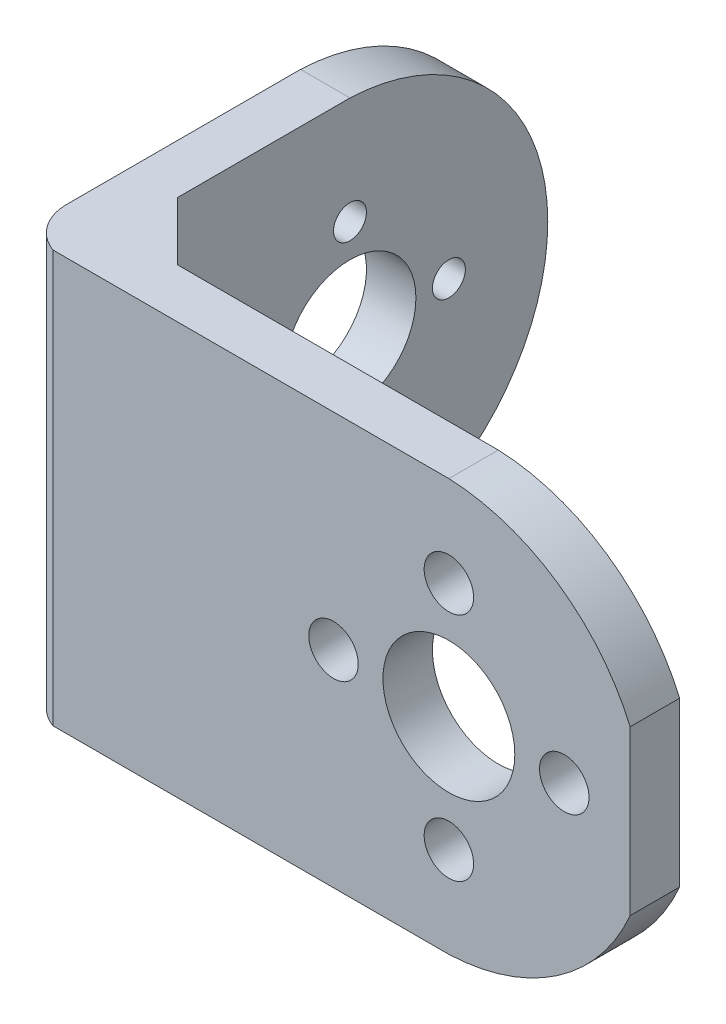
ISO-10303-21;
HEADER;
FILE_DESCRIPTION(('STEP AP214'),'2;1');
FILE_NAME('part.step','',(''),(''),'','','');
FILE_SCHEMA(('AUTOMOTIVE_DESIGN { 1 0 10303 214 1 1 1 1 }'));
ENDSEC;
DATA;
#1=APPLICATION_CONTEXT('core data for automotive mechanical design processes');
#2=APPLICATION_PROTOCOL_DEFINITION('international standard','automotive_design',2000,#1);
#3=PRODUCT_CONTEXT('',#1,'mechanical');
#4=PRODUCT('Part','Part','',(#3));
#5=PRODUCT_RELATED_PRODUCT_CATEGORY('part','',(#4));
#6=PRODUCT_DEFINITION_FORMATION('','',#4);
#7=PRODUCT_DEFINITION_CONTEXT('part definition',#1,'design');
#8=PRODUCT_DEFINITION('design','',#6,#7);
#9=PRODUCT_DEFINITION_SHAPE('','',#8);
#10=(LENGTH_UNIT() NAMED_UNIT(*) SI_UNIT(.MILLI.,.METRE.));
#11=(NAMED_UNIT(*) PLANE_ANGLE_UNIT() SI_UNIT($,.RADIAN.));
#12=(NAMED_UNIT(*) SI_UNIT($,.STERADIAN.) SOLID_ANGLE_UNIT());
#13=UNCERTAINTY_MEASURE_WITH_UNIT(LENGTH_MEASURE(1.E-05),#10,'distance_accuracy_value','');
#14=(GEOMETRIC_REPRESENTATION_CONTEXT(3) GLOBAL_UNCERTAINTY_ASSIGNED_CONTEXT((#13)) GLOBAL_UNIT_ASSIGNED_CONTEXT((#10,
#11,#12)) REPRESENTATION_CONTEXT('',''));
#15=CARTESIAN_POINT('',(0.,0.,0.));
#16=DIRECTION('',(0.,0.,1.));
#17=DIRECTION('',(1.,0.,0.));
#18=AXIS2_PLACEMENT_3D('',#15,#16,#17);
#19=CARTESIAN_POINT('',(0.,25.,1.));
#20=DIRECTION('',(0.,0.,-1.));
#21=DIRECTION('',(-1.,0.,0.));
#22=AXIS2_PLACEMENT_3D('',#19,#20,#21);
#23=PLANE('',#22);
#24=CARTESIAN_POINT('',(25.,19.5,1.));
#25=DIRECTION('',(0.,0.,1.));
#26=DIRECTION('',(1.,0.,0.));
#27=AXIS2_PLACEMENT_3D('',#24,#25,#26);
#28=CIRCLE('',#27,1.5);
#29=CARTESIAN_POINT('',(26.5,19.5,1.));
#30=VERTEX_POINT('',#29);
#31=EDGE_CURVE('E258',#30,#30,#28,.T.);
#32=ORIENTED_EDGE('',*,*,#31,.F.);
#33=EDGE_LOOP('',(#32));
#34=FACE_BOUND('',#33,.T.);
#35=CARTESIAN_POINT('',(32.0000000000001,12.5000000000001,1.));
#36=DIRECTION('',(0.,0.,1.));
#37=DIRECTION('',(1.,0.,0.));
#38=AXIS2_PLACEMENT_3D('',#35,#36,#37);
#39=CIRCLE('',#38,1.5);
#40=CARTESIAN_POINT('',(33.5000000000001,12.5000000000001,1.));
#41=VERTEX_POINT('',#40);
#42=EDGE_CURVE('E255',#41,#41,#39,.T.);
#43=ORIENTED_EDGE('',*,*,#42,.F.);
#44=EDGE_LOOP('',(#43));
#45=FACE_BOUND('',#44,.T.);
#46=CARTESIAN_POINT('',(25.0000000000002,5.5,1.));
#47=DIRECTION('',(0.,0.,1.));
#48=DIRECTION('',(1.,0.,0.));
#49=AXIS2_PLACEMENT_3D('',#46,#47,#48);
#50=CIRCLE('',#49,1.5);
#51=CARTESIAN_POINT('',(26.5000000000002,5.5,1.));
#52=VERTEX_POINT('',#51);
#53=EDGE_CURVE('E252',#52,#52,#50,.T.);
#54=ORIENTED_EDGE('',*,*,#53,.F.);
#55=EDGE_LOOP('',(#54));
#56=FACE_BOUND('',#55,.T.);
#57=CARTESIAN_POINT('',(18.0000000000001,12.5,1.));
#58=DIRECTION('',(0.,0.,1.));
#59=DIRECTION('',(1.,0.,0.));
#60=AXIS2_PLACEMENT_3D('',#57,#58,#59);
#61=CIRCLE('',#60,1.5);
#62=CARTESIAN_POINT('',(19.5000000000001,12.5,1.));
#63=VERTEX_POINT('',#62);
#64=EDGE_CURVE('E251',#63,#63,#61,.T.);
#65=ORIENTED_EDGE('',*,*,#64,.F.);
#66=EDGE_LOOP('',(#65));
#67=FACE_BOUND('',#66,.T.);
#68=CARTESIAN_POINT('',(25.,12.5,1.));
#69=DIRECTION('',(0.,0.,1.));
#70=DIRECTION('',(1.,0.,0.));
#71=AXIS2_PLACEMENT_3D('',#68,#69,#70);
#72=CIRCLE('',#71,4.);
#73=CARTESIAN_POINT('',(29.,12.5,1.));
#74=VERTEX_POINT('',#73);
#75=EDGE_CURVE('E176',#74,#74,#72,.T.);
#76=ORIENTED_EDGE('',*,*,#75,.F.);
#77=EDGE_LOOP('',(#76));
#78=FACE_BOUND('',#77,.T.);
#79=CARTESIAN_POINT('',(24.5166193979498,12.5,1.));
#80=DIRECTION('',(0.,0.,1.));
#81=DIRECTION('',(1.,0.,0.));
#82=AXIS2_PLACEMENT_3D('',#79,#80,#81);
#83=CIRCLE('',#82,12.5093427807554);
#84=CARTESIAN_POINT('',(36.,17.4614137858976,1.));
#85=VERTEX_POINT('',#84);
#86=CARTESIAN_POINT('',(25.,25.,1.));
#87=VERTEX_POINT('',#86);
#88=EDGE_CURVE('E192',#85,#87,#83,.T.);
#89=ORIENTED_EDGE('',*,*,#88,.T.);
#90=DIRECTION('',(1.,0.,0.));
#91=VECTOR('',#90,1.);
#92=CARTESIAN_POINT('',(0.,25.,1.));
#93=LINE('',#92,#91);
#94=CARTESIAN_POINT('',(0.979760199388005,25.,1.));
#95=VERTEX_POINT('',#94);
#96=EDGE_CURVE('E207',#95,#87,#93,.T.);
#97=ORIENTED_EDGE('',*,*,#96,.F.);
#98=DIRECTION('',(0.,-1.,0.));
#99=VECTOR('',#98,1.);
#100=CARTESIAN_POINT('',(0.979760199388005,25.,1.));
#101=LINE('',#100,#99);
#102=CARTESIAN_POINT('',(0.979760199388005,0.,1.));
#103=VERTEX_POINT('',#102);
#104=EDGE_CURVE('E161',#95,#103,#101,.T.);
#105=ORIENTED_EDGE('',*,*,#104,.T.);
#106=DIRECTION('',(1.,0.,0.));
#107=VECTOR('',#106,1.);
#108=CARTESIAN_POINT('',(0.,0.,1.));
#109=LINE('',#108,#107);
#110=CARTESIAN_POINT('',(25.,0.,1.));
#111=VERTEX_POINT('',#110);
#112=EDGE_CURVE('E150',#103,#111,#109,.T.);
#113=ORIENTED_EDGE('',*,*,#112,.T.);
#114=CARTESIAN_POINT('',(24.5166193979498,12.5,1.));
#115=DIRECTION('',(0.,0.,1.));
#116=DIRECTION('',(1.,0.,0.));
#117=AXIS2_PLACEMENT_3D('',#114,#115,#116);
#118=CIRCLE('',#117,12.5093427807554);
#119=CARTESIAN_POINT('',(36.,7.53858621410237,1.));
#120=VERTEX_POINT('',#119);
#121=EDGE_CURVE('E61',#111,#120,#118,.T.);
#122=ORIENTED_EDGE('',*,*,#121,.T.);
#123=DIRECTION('',(0.,-1.,0.));
#124=VECTOR('',#123,1.);
#125=CARTESIAN_POINT('',(36.,25.,1.));
#126=LINE('',#125,#124);
#127=EDGE_CURVE('E158',#85,#120,#126,.T.);
#128=ORIENTED_EDGE('',*,*,#127,.F.);
#129=EDGE_LOOP('',(#89,#97,#105,#113,#122,#128));
#130=FACE_BOUND('',#129,.T.);
#131=ADVANCED_FACE('F38',(#34,#45,#56,#67,#78,#130),#23,.F.);
#132=CARTESIAN_POINT('',(36.,25.,0.));
#133=DIRECTION('',(-1.,0.,0.));
#134=DIRECTION('',(0.,0.,1.));
#135=AXIS2_PLACEMENT_3D('',#132,#133,#134);
#136=PLANE('',#135);
#137=DIRECTION('',(0.,0.,1.));
#138=VECTOR('',#137,1.);
#139=CARTESIAN_POINT('',(36.,17.4614137858976,-24.));
#140=LINE('',#139,#138);
#141=CARTESIAN_POINT('',(36.,17.4614137858976,-2.));
#142=VERTEX_POINT('',#141);
#143=EDGE_CURVE('E195',#142,#85,#140,.T.);
#144=ORIENTED_EDGE('',*,*,#143,.T.);
#145=ORIENTED_EDGE('',*,*,#127,.T.);
#146=DIRECTION('',(0.,0.,1.));
#147=VECTOR('',#146,1.);
#148=CARTESIAN_POINT('',(36.,7.53858621410237,-24.));
#149=LINE('',#148,#147);
#150=CARTESIAN_POINT('',(36.,7.53858621410237,-2.));
#151=VERTEX_POINT('',#150);
#152=EDGE_CURVE('E188',#151,#120,#149,.T.);
#153=ORIENTED_EDGE('',*,*,#152,.F.);
#154=DIRECTION('',(0.,-1.,0.));
#155=VECTOR('',#154,1.);
#156=CARTESIAN_POINT('',(36.,25.,-2.));
#157=LINE('',#156,#155);
#158=EDGE_CURVE('E155',#142,#151,#157,.T.);
#159=ORIENTED_EDGE('',*,*,#158,.F.);
#160=EDGE_LOOP('',(#144,#145,#153,#159));
#161=FACE_BOUND('',#160,.T.);
#162=ADVANCED_FACE('F267',(#161),#136,.F.);
#163=CARTESIAN_POINT('',(0.,25.,-2.));
#164=DIRECTION('',(0.,0.,1.));
#165=DIRECTION('',(1.,0.,0.));
#166=AXIS2_PLACEMENT_3D('',#163,#164,#165);
#167=PLANE('',#166);
#168=CARTESIAN_POINT('',(25.,19.5,-2.));
#169=DIRECTION('',(0.,0.,1.));
#170=DIRECTION('',(1.,0.,0.));
#171=AXIS2_PLACEMENT_3D('',#168,#169,#170);
#172=CIRCLE('',#171,1.5);
#173=CARTESIAN_POINT('',(26.5,19.5,-2.));
#174=VERTEX_POINT('',#173);
#175=EDGE_CURVE('E184',#174,#174,#172,.T.);
#176=ORIENTED_EDGE('',*,*,#175,.T.);
#177=EDGE_LOOP('',(#176));
#178=FACE_BOUND('',#177,.T.);
#179=CARTESIAN_POINT('',(32.0000000000001,12.5000000000001,-2.));
#180=DIRECTION('',(0.,0.,1.));
#181=DIRECTION('',(1.,0.,0.));
#182=AXIS2_PLACEMENT_3D('',#179,#180,#181);
#183=CIRCLE('',#182,1.5);
#184=CARTESIAN_POINT('',(33.5000000000001,12.5000000000001,-2.));
#185=VERTEX_POINT('',#184);
#186=EDGE_CURVE('E182',#185,#185,#183,.T.);
#187=ORIENTED_EDGE('',*,*,#186,.T.);
#188=EDGE_LOOP('',(#187));
#189=FACE_BOUND('',#188,.T.);
#190=CARTESIAN_POINT('',(25.0000000000002,5.5,-2.));
#191=DIRECTION('',(0.,0.,1.));
#192=DIRECTION('',(1.,0.,0.));
#193=AXIS2_PLACEMENT_3D('',#190,#191,#192);
#194=CIRCLE('',#193,1.5);
#195=CARTESIAN_POINT('',(26.5000000000002,5.5,-2.));
#196=VERTEX_POINT('',#195);
#197=EDGE_CURVE('E179',#196,#196,#194,.T.);
#198=ORIENTED_EDGE('',*,*,#197,.T.);
#199=EDGE_LOOP('',(#198));
#200=FACE_BOUND('',#199,.T.);
#201=CARTESIAN_POINT('',(18.0000000000001,12.5,-2.));
#202=DIRECTION('',(0.,0.,1.));
#203=DIRECTION('',(1.,0.,0.));
#204=AXIS2_PLACEMENT_3D('',#201,#202,#203);
#205=CIRCLE('',#204,1.5);
#206=CARTESIAN_POINT('',(19.5000000000001,12.5,-2.));
#207=VERTEX_POINT('',#206);
#208=EDGE_CURVE('E175',#207,#207,#205,.T.);
#209=ORIENTED_EDGE('',*,*,#208,.T.);
#210=EDGE_LOOP('',(#209));
#211=FACE_BOUND('',#210,.T.);
#212=CARTESIAN_POINT('',(25.,12.5,-2.));
#213=DIRECTION('',(0.,0.,1.));
#214=DIRECTION('',(1.,0.,0.));
#215=AXIS2_PLACEMENT_3D('',#212,#213,#214);
#216=CIRCLE('',#215,4.);
#217=CARTESIAN_POINT('',(29.,12.5,-2.));
#218=VERTEX_POINT('',#217);
#219=EDGE_CURVE('E172',#218,#218,#216,.T.);
#220=ORIENTED_EDGE('',*,*,#219,.T.);
#221=EDGE_LOOP('',(#220));
#222=FACE_BOUND('',#221,.T.);
#223=DIRECTION('',(-1.,0.,0.));
#224=VECTOR('',#223,1.);
#225=CARTESIAN_POINT('',(0.,0.,-2.));
#226=LINE('',#225,#224);
#227=CARTESIAN_POINT('',(25.,0.,-2.));
#228=VERTEX_POINT('',#227);
#229=CARTESIAN_POINT('',(5.54335490127289,0.,-2.));
#230=VERTEX_POINT('',#229);
#231=EDGE_CURVE('E153',#228,#230,#226,.T.);
#232=ORIENTED_EDGE('',*,*,#231,.T.);
#233=DIRECTION('',(0.,1.,0.));
#234=VECTOR('',#233,1.);
#235=CARTESIAN_POINT('',(5.54335490127289,25.,-2.));
#236=LINE('',#235,#234);
#237=CARTESIAN_POINT('',(5.54335490127289,25.,-2.));
#238=VERTEX_POINT('',#237);
#239=EDGE_CURVE('E118',#230,#238,#236,.T.);
#240=ORIENTED_EDGE('',*,*,#239,.T.);
#241=DIRECTION('',(-1.,0.,0.));
#242=VECTOR('',#241,1.);
#243=CARTESIAN_POINT('',(0.,25.,-2.));
#244=LINE('',#243,#242);
#245=CARTESIAN_POINT('',(25.,25.,-2.));
#246=VERTEX_POINT('',#245);
#247=EDGE_CURVE('E146',#246,#238,#244,.T.);
#248=ORIENTED_EDGE('',*,*,#247,.F.);
#249=CARTESIAN_POINT('',(24.5166193979498,12.5,-2.));
#250=DIRECTION('',(0.,0.,1.));
#251=DIRECTION('',(1.,0.,0.));
#252=AXIS2_PLACEMENT_3D('',#249,#250,#251);
#253=CIRCLE('',#252,12.5093427807554);
#254=EDGE_CURVE('E53',#142,#246,#253,.T.);
#255=ORIENTED_EDGE('',*,*,#254,.F.);
#256=ORIENTED_EDGE('',*,*,#158,.T.);
#257=CARTESIAN_POINT('',(24.5166193979498,12.5,-2.));
#258=DIRECTION('',(0.,0.,1.));
#259=DIRECTION('',(1.,0.,0.));
#260=AXIS2_PLACEMENT_3D('',#257,#258,#259);
#261=CIRCLE('',#260,12.5093427807554);
#262=EDGE_CURVE('E198',#228,#151,#261,.T.);
#263=ORIENTED_EDGE('',*,*,#262,.F.);
#264=EDGE_LOOP('',(#232,#240,#248,#255,#256,#263));
#265=FACE_BOUND('',#264,.T.);
#266=ADVANCED_FACE('F215',(#178,#189,#200,#211,#222,#265),#167,.F.);
#267=CARTESIAN_POINT('',(0.,25.,0.));
#268=DIRECTION('',(0.,1.,0.));
#269=DIRECTION('',(0.,0.,1.));
#270=AXIS2_PLACEMENT_3D('',#267,#268,#269);
#271=PLANE('',#270);
#272=ORIENTED_EDGE('',*,*,#247,.T.);
#273=DIRECTION('',(-0.707106781186548,0.,-0.707106781186548));
#274=VECTOR('',#273,1.);
#275=CARTESIAN_POINT('',(0.998168154015269,25.,-6.54518674725762));
#276=LINE('',#275,#274);
#277=CARTESIAN_POINT('',(2.,25.,-5.54335490127289));
#278=VERTEX_POINT('',#277);
#279=EDGE_CURVE('E123',#238,#278,#276,.T.);
#280=ORIENTED_EDGE('',*,*,#279,.T.);
#281=DIRECTION('',(0.,0.,1.));
#282=VECTOR('',#281,1.);
#283=CARTESIAN_POINT('',(2.,25.,0.));
#284=LINE('',#283,#282);
#285=CARTESIAN_POINT('',(2.,25.,-16.));
#286=VERTEX_POINT('',#285);
#287=EDGE_CURVE('E132',#286,#278,#284,.T.);
#288=ORIENTED_EDGE('',*,*,#287,.F.);
#289=DIRECTION('',(-1.,0.,0.));
#290=VECTOR('',#289,1.);
#291=CARTESIAN_POINT('',(24.,25.,-16.));
#292=LINE('',#291,#290);
#293=CARTESIAN_POINT('',(-1.,25.,-16.));
#294=VERTEX_POINT('',#293);
#295=EDGE_CURVE('E166',#294,#286,#292,.F.);
#296=ORIENTED_EDGE('',*,*,#295,.F.);
#297=DIRECTION('',(0.,0.,-1.));
#298=VECTOR('',#297,1.);
#299=CARTESIAN_POINT('',(-1.,25.,0.));
#300=LINE('',#299,#298);
#301=CARTESIAN_POINT('',(-1.,25.,-1.65907540690337));
#302=VERTEX_POINT('',#301);
#303=EDGE_CURVE('E203',#302,#294,#300,.T.);
#304=ORIENTED_EDGE('',*,*,#303,.F.);
#305=CARTESIAN_POINT('',(2.00457516811089,25.,-1.82953770345168));
#306=DIRECTION('',(0.,1.,0.));
#307=DIRECTION('',(0.,0.,1.));
#308=AXIS2_PLACEMENT_3D('',#305,#306,#307);
#309=CIRCLE('',#308,3.00940680788974);
#310=EDGE_CURVE('E206',#302,#95,#309,.T.);
#311=ORIENTED_EDGE('',*,*,#310,.T.);
#312=ORIENTED_EDGE('',*,*,#96,.T.);
#313=DIRECTION('',(0.,0.,1.));
#314=VECTOR('',#313,1.);
#315=CARTESIAN_POINT('',(25.,25.,-24.));
#316=LINE('',#315,#314);
#317=EDGE_CURVE('E46',#87,#246,#316,.F.);
#318=ORIENTED_EDGE('',*,*,#317,.T.);
#319=EDGE_LOOP('',(#272,#280,#288,#296,#304,#311,#312,#318));
#320=FACE_BOUND('',#319,.T.);
#321=ADVANCED_FACE('F213',(#320),#271,.T.);
#322=CARTESIAN_POINT('',(0.,0.,0.));
#323=DIRECTION('',(0.,1.,0.));
#324=DIRECTION('',(0.,0.,1.));
#325=AXIS2_PLACEMENT_3D('',#322,#323,#324);
#326=PLANE('',#325);
#327=DIRECTION('',(0.707106781186548,0.,0.707106781186548));
#328=VECTOR('',#327,1.);
#329=CARTESIAN_POINT('',(0.998168154015269,0.,-6.54518674725762));
#330=LINE('',#329,#328);
#331=CARTESIAN_POINT('',(2.,0.,-5.54335490127289));
#332=VERTEX_POINT('',#331);
#333=EDGE_CURVE('E113',#332,#230,#330,.T.);
#334=ORIENTED_EDGE('',*,*,#333,.T.);
#335=ORIENTED_EDGE('',*,*,#231,.F.);
#336=DIRECTION('',(0.,0.,1.));
#337=VECTOR('',#336,1.);
#338=CARTESIAN_POINT('',(25.,0.,-24.));
#339=LINE('',#338,#337);
#340=EDGE_CURVE('E169',#111,#228,#339,.F.);
#341=ORIENTED_EDGE('',*,*,#340,.F.);
#342=ORIENTED_EDGE('',*,*,#112,.F.);
#343=CARTESIAN_POINT('',(2.00457516811089,0.,-1.82953770345168));
#344=DIRECTION('',(0.,1.,0.));
#345=DIRECTION('',(0.,0.,1.));
#346=AXIS2_PLACEMENT_3D('',#343,#344,#345);
#347=CIRCLE('',#346,3.00940680788974);
#348=CARTESIAN_POINT('',(-1.,0.,-1.65907540690337));
#349=VERTEX_POINT('',#348);
#350=EDGE_CURVE('E141',#349,#103,#347,.T.);
#351=ORIENTED_EDGE('',*,*,#350,.F.);
#352=DIRECTION('',(0.,0.,-1.));
#353=VECTOR('',#352,1.);
#354=CARTESIAN_POINT('',(-1.,0.,0.));
#355=LINE('',#354,#353);
#356=CARTESIAN_POINT('',(-1.,0.,-16.));
#357=VERTEX_POINT('',#356);
#358=EDGE_CURVE('E138',#349,#357,#355,.T.);
#359=ORIENTED_EDGE('',*,*,#358,.T.);
#360=DIRECTION('',(-1.,0.,0.));
#361=VECTOR('',#360,1.);
#362=CARTESIAN_POINT('',(24.,0.,-16.));
#363=LINE('',#362,#361);
#364=CARTESIAN_POINT('',(2.,0.,-16.));
#365=VERTEX_POINT('',#364);
#366=EDGE_CURVE('E137',#357,#365,#363,.F.);
#367=ORIENTED_EDGE('',*,*,#366,.T.);
#368=DIRECTION('',(0.,0.,1.));
#369=VECTOR('',#368,1.);
#370=CARTESIAN_POINT('',(2.,0.,0.));
#371=LINE('',#370,#369);
#372=EDGE_CURVE('E130',#365,#332,#371,.T.);
#373=ORIENTED_EDGE('',*,*,#372,.T.);
#374=EDGE_LOOP('',(#334,#335,#341,#342,#351,#359,#367,#373));
#375=FACE_BOUND('',#374,.T.);
#376=ADVANCED_FACE('F134',(#375),#326,.F.);
#377=CARTESIAN_POINT('',(2.,25.,0.));
#378=DIRECTION('',(1.,0.,0.));
#379=DIRECTION('',(0.,0.,-1.));
#380=AXIS2_PLACEMENT_3D('',#377,#378,#379);
#381=PLANE('',#380);
#382=DIRECTION('',(0.,1.,0.));
#383=VECTOR('',#382,1.);
#384=CARTESIAN_POINT('',(2.,25.,-5.54335490127289));
#385=LINE('',#384,#383);
#386=EDGE_CURVE('E12',#332,#278,#385,.T.);
#387=ORIENTED_EDGE('',*,*,#386,.F.);
#388=ORIENTED_EDGE('',*,*,#372,.F.);
#389=CARTESIAN_POINT('',(2.,12.5,-15.4895833333333));
#390=DIRECTION('',(1.,0.,0.));
#391=DIRECTION('',(0.,0.,-1.));
#392=AXIS2_PLACEMENT_3D('',#389,#390,#391);
#393=CIRCLE('',#392,12.5104166666667);
#394=EDGE_CURVE('E139',#286,#365,#393,.F.);
#395=ORIENTED_EDGE('',*,*,#394,.F.);
#396=ORIENTED_EDGE('',*,*,#287,.T.);
#397=EDGE_LOOP('',(#387,#388,#395,#396));
#398=FACE_BOUND('',#397,.T.);
#399=CARTESIAN_POINT('',(2.,18.5,-16.));
#400=DIRECTION('',(1.,0.,0.));
#401=DIRECTION('',(0.,0.,-1.));
#402=AXIS2_PLACEMENT_3D('',#399,#400,#401);
#403=CIRCLE('',#402,1.);
#404=CARTESIAN_POINT('',(2.,18.5,-17.));
#405=VERTEX_POINT('',#404);
#406=EDGE_CURVE('E248',#405,#405,#403,.T.);
#407=ORIENTED_EDGE('',*,*,#406,.F.);
#408=EDGE_LOOP('',(#407));
#409=FACE_BOUND('',#408,.T.);
#410=CARTESIAN_POINT('',(2.,12.5000000000001,-9.99999999999991));
#411=DIRECTION('',(1.,0.,0.));
#412=DIRECTION('',(0.,0.,-1.));
#413=AXIS2_PLACEMENT_3D('',#410,#411,#412);
#414=CIRCLE('',#413,1.);
#415=CARTESIAN_POINT('',(2.,12.5000000000001,-10.9999999999999));
#416=VERTEX_POINT('',#415);
#417=EDGE_CURVE('E245',#416,#416,#414,.T.);
#418=ORIENTED_EDGE('',*,*,#417,.F.);
#419=EDGE_LOOP('',(#418));
#420=FACE_BOUND('',#419,.T.);
#421=CARTESIAN_POINT('',(2.,6.5,-15.9999999999999));
#422=DIRECTION('',(1.,0.,0.));
#423=DIRECTION('',(0.,0.,-1.));
#424=AXIS2_PLACEMENT_3D('',#421,#422,#423);
#425=CIRCLE('',#424,1.);
#426=CARTESIAN_POINT('',(2.,6.5,-16.9999999999999));
#427=VERTEX_POINT('',#426);
#428=EDGE_CURVE('E242',#427,#427,#425,.T.);
#429=ORIENTED_EDGE('',*,*,#428,.F.);
#430=EDGE_LOOP('',(#429));
#431=FACE_BOUND('',#430,.T.);
#432=CARTESIAN_POINT('',(2.,12.5,-21.9999999999999));
#433=DIRECTION('',(1.,0.,0.));
#434=DIRECTION('',(0.,0.,-1.));
#435=AXIS2_PLACEMENT_3D('',#432,#433,#434);
#436=CIRCLE('',#435,0.999999999999999);
#437=CARTESIAN_POINT('',(2.,12.5,-22.9999999999999));
#438=VERTEX_POINT('',#437);
#439=EDGE_CURVE('E239',#438,#438,#436,.T.);
#440=ORIENTED_EDGE('',*,*,#439,.F.);
#441=EDGE_LOOP('',(#440));
#442=FACE_BOUND('',#441,.T.);
#443=CARTESIAN_POINT('',(2.,12.5,-16.));
#444=DIRECTION('',(1.,0.,0.));
#445=DIRECTION('',(0.,0.,-1.));
#446=AXIS2_PLACEMENT_3D('',#443,#444,#445);
#447=CIRCLE('',#446,4.);
#448=CARTESIAN_POINT('',(2.,12.5,-20.));
#449=VERTEX_POINT('',#448);
#450=EDGE_CURVE('E236',#449,#449,#447,.T.);
#451=ORIENTED_EDGE('',*,*,#450,.F.);
#452=EDGE_LOOP('',(#451));
#453=FACE_BOUND('',#452,.T.);
#454=ADVANCED_FACE('F40',(#398,#409,#420,#431,#442,#453),#381,.T.);
#455=CARTESIAN_POINT('',(-1.,25.,0.));
#456=DIRECTION('',(-1.,0.,0.));
#457=DIRECTION('',(0.,0.,1.));
#458=AXIS2_PLACEMENT_3D('',#455,#456,#457);
#459=PLANE('',#458);
#460=CARTESIAN_POINT('',(-1.,18.5,-16.));
#461=DIRECTION('',(-1.,0.,0.));
#462=DIRECTION('',(0.,0.,1.));
#463=AXIS2_PLACEMENT_3D('',#460,#461,#462);
#464=CIRCLE('',#463,1.);
#465=CARTESIAN_POINT('',(-1.,18.5,-15.));
#466=VERTEX_POINT('',#465);
#467=EDGE_CURVE('E228',#466,#466,#464,.T.);
#468=ORIENTED_EDGE('',*,*,#467,.F.);
#469=EDGE_LOOP('',(#468));
#470=FACE_BOUND('',#469,.T.);
#471=CARTESIAN_POINT('',(-1.,12.5000000000001,-9.99999999999991));
#472=DIRECTION('',(-1.,0.,0.));
#473=DIRECTION('',(0.,0.,1.));
#474=AXIS2_PLACEMENT_3D('',#471,#472,#473);
#475=CIRCLE('',#474,1.);
#476=CARTESIAN_POINT('',(-1.,12.5000000000001,-8.99999999999991));
#477=VERTEX_POINT('',#476);
#478=EDGE_CURVE('E226',#477,#477,#475,.T.);
#479=ORIENTED_EDGE('',*,*,#478,.F.);
#480=EDGE_LOOP('',(#479));
#481=FACE_BOUND('',#480,.T.);
#482=CARTESIAN_POINT('',(-1.,6.5,-15.9999999999999));
#483=DIRECTION('',(-1.,0.,0.));
#484=DIRECTION('',(0.,0.,1.));
#485=AXIS2_PLACEMENT_3D('',#482,#483,#484);
#486=CIRCLE('',#485,1.);
#487=CARTESIAN_POINT('',(-1.,6.5,-14.9999999999999));
#488=VERTEX_POINT('',#487);
#489=EDGE_CURVE('E221',#488,#488,#486,.T.);
#490=ORIENTED_EDGE('',*,*,#489,.F.);
#491=EDGE_LOOP('',(#490));
#492=FACE_BOUND('',#491,.T.);
#493=CARTESIAN_POINT('',(-1.,12.5,-21.9999999999999));
#494=DIRECTION('',(-1.,0.,0.));
#495=DIRECTION('',(0.,0.,1.));
#496=AXIS2_PLACEMENT_3D('',#493,#494,#495);
#497=CIRCLE('',#496,0.999999999999999);
#498=CARTESIAN_POINT('',(-1.,12.5,-20.9999999999999));
#499=VERTEX_POINT('',#498);
#500=EDGE_CURVE('E218',#499,#499,#497,.T.);
#501=ORIENTED_EDGE('',*,*,#500,.F.);
#502=EDGE_LOOP('',(#501));
#503=FACE_BOUND('',#502,.T.);
#504=CARTESIAN_POINT('',(-1.,12.5,-16.));
#505=DIRECTION('',(-1.,0.,0.));
#506=DIRECTION('',(0.,0.,1.));
#507=AXIS2_PLACEMENT_3D('',#504,#505,#506);
#508=CIRCLE('',#507,4.);
#509=CARTESIAN_POINT('',(-1.,12.5,-12.));
#510=VERTEX_POINT('',#509);
#511=EDGE_CURVE('E231',#510,#510,#508,.T.);
#512=ORIENTED_EDGE('',*,*,#511,.F.);
#513=EDGE_LOOP('',(#512));
#514=FACE_BOUND('',#513,.T.);
#515=CARTESIAN_POINT('',(-1.,12.5,-15.4895833333333));
#516=DIRECTION('',(-1.,0.,0.));
#517=DIRECTION('',(0.,0.,1.));
#518=AXIS2_PLACEMENT_3D('',#515,#516,#517);
#519=CIRCLE('',#518,12.5104166666667);
#520=EDGE_CURVE('E143',#357,#294,#519,.F.);
#521=ORIENTED_EDGE('',*,*,#520,.F.);
#522=ORIENTED_EDGE('',*,*,#358,.F.);
#523=DIRECTION('',(0.,-1.,0.));
#524=VECTOR('',#523,1.);
#525=CARTESIAN_POINT('',(-1.,25.,-1.65907540690337));
#526=LINE('',#525,#524);
#527=EDGE_CURVE('E164',#302,#349,#526,.T.);
#528=ORIENTED_EDGE('',*,*,#527,.F.);
#529=ORIENTED_EDGE('',*,*,#303,.T.);
#530=EDGE_LOOP('',(#521,#522,#528,#529));
#531=FACE_BOUND('',#530,.T.);
#532=ADVANCED_FACE('F283',(#470,#481,#492,#503,#514,#531),#459,.T.);
#533=CARTESIAN_POINT('',(2.00457516811089,25.,-1.82953770345168));
#534=DIRECTION('',(0.,-1.,0.));
#535=DIRECTION('',(0.,0.,-1.));
#536=AXIS2_PLACEMENT_3D('',#533,#534,#535);
#537=CYLINDRICAL_SURFACE('',#536,3.00940680788974);
#538=ORIENTED_EDGE('',*,*,#350,.T.);
#539=ORIENTED_EDGE('',*,*,#104,.F.);
#540=ORIENTED_EDGE('',*,*,#310,.F.);
#541=ORIENTED_EDGE('',*,*,#527,.T.);
#542=EDGE_LOOP('',(#538,#539,#540,#541));
#543=FACE_BOUND('',#542,.T.);
#544=ADVANCED_FACE('F280',(#543),#537,.T.);
#545=CARTESIAN_POINT('',(24.,12.5,-15.4895833333333));
#546=DIRECTION('',(-1.,0.,0.));
#547=DIRECTION('',(0.,0.,1.));
#548=AXIS2_PLACEMENT_3D('',#545,#546,#547);
#549=CYLINDRICAL_SURFACE('',#548,12.5104166666667);
#550=ORIENTED_EDGE('',*,*,#394,.T.);
#551=ORIENTED_EDGE('',*,*,#366,.F.);
#552=ORIENTED_EDGE('',*,*,#520,.T.);
#553=ORIENTED_EDGE('',*,*,#295,.T.);
#554=EDGE_LOOP('',(#550,#551,#552,#553));
#555=FACE_BOUND('',#554,.T.);
#556=ADVANCED_FACE('F282',(#555),#549,.T.);
#557=CARTESIAN_POINT('',(24.5166193979498,12.5,-24.));
#558=DIRECTION('',(0.,0.,1.));
#559=DIRECTION('',(1.,0.,0.));
#560=AXIS2_PLACEMENT_3D('',#557,#558,#559);
#561=CYLINDRICAL_SURFACE('',#560,12.5093427807554);
#562=ORIENTED_EDGE('',*,*,#262,.T.);
#563=ORIENTED_EDGE('',*,*,#152,.T.);
#564=ORIENTED_EDGE('',*,*,#121,.F.);
#565=ORIENTED_EDGE('',*,*,#340,.T.);
#566=EDGE_LOOP('',(#562,#563,#564,#565));
#567=FACE_BOUND('',#566,.T.);
#568=ADVANCED_FACE('F309',(#567),#561,.T.);
#569=CARTESIAN_POINT('',(24.5166193979498,12.5,-24.));
#570=DIRECTION('',(0.,0.,1.));
#571=DIRECTION('',(1.,0.,0.));
#572=AXIS2_PLACEMENT_3D('',#569,#570,#571);
#573=CYLINDRICAL_SURFACE('',#572,12.5093427807554);
#574=ORIENTED_EDGE('',*,*,#254,.T.);
#575=ORIENTED_EDGE('',*,*,#317,.F.);
#576=ORIENTED_EDGE('',*,*,#88,.F.);
#577=ORIENTED_EDGE('',*,*,#143,.F.);
#578=EDGE_LOOP('',(#574,#575,#576,#577));
#579=FACE_BOUND('',#578,.T.);
#580=ADVANCED_FACE('F311',(#579),#573,.T.);
#581=CARTESIAN_POINT('',(25.,12.5,-24.));
#582=DIRECTION('',(0.,0.,1.));
#583=DIRECTION('',(1.,0.,0.));
#584=AXIS2_PLACEMENT_3D('',#581,#582,#583);
#585=CYLINDRICAL_SURFACE('',#584,4.);
#586=ORIENTED_EDGE('',*,*,#75,.T.);
#587=EDGE_LOOP('',(#586));
#588=FACE_BOUND('',#587,.T.);
#589=ORIENTED_EDGE('',*,*,#219,.F.);
#590=EDGE_LOOP('',(#589));
#591=FACE_BOUND('',#590,.T.);
#592=ADVANCED_FACE('F317',(#588,#591),#585,.F.);
#593=CARTESIAN_POINT('',(18.0000000000001,12.5,-24.));
#594=DIRECTION('',(0.,0.,1.));
#595=DIRECTION('',(1.,0.,0.));
#596=AXIS2_PLACEMENT_3D('',#593,#594,#595);
#597=CYLINDRICAL_SURFACE('',#596,1.5);
#598=ORIENTED_EDGE('',*,*,#64,.T.);
#599=EDGE_LOOP('',(#598));
#600=FACE_BOUND('',#599,.T.);
#601=ORIENTED_EDGE('',*,*,#208,.F.);
#602=EDGE_LOOP('',(#601));
#603=FACE_BOUND('',#602,.T.);
#604=ADVANCED_FACE('F340',(#600,#603),#597,.F.);
#605=CARTESIAN_POINT('',(25.0000000000002,5.5,-24.));
#606=DIRECTION('',(0.,0.,1.));
#607=DIRECTION('',(1.,0.,0.));
#608=AXIS2_PLACEMENT_3D('',#605,#606,#607);
#609=CYLINDRICAL_SURFACE('',#608,1.5);
#610=ORIENTED_EDGE('',*,*,#53,.T.);
#611=EDGE_LOOP('',(#610));
#612=FACE_BOUND('',#611,.T.);
#613=ORIENTED_EDGE('',*,*,#197,.F.);
#614=EDGE_LOOP('',(#613));
#615=FACE_BOUND('',#614,.T.);
#616=ADVANCED_FACE('F345',(#612,#615),#609,.F.);
#617=CARTESIAN_POINT('',(32.0000000000001,12.5000000000001,-24.));
#618=DIRECTION('',(0.,0.,1.));
#619=DIRECTION('',(1.,0.,0.));
#620=AXIS2_PLACEMENT_3D('',#617,#618,#619);
#621=CYLINDRICAL_SURFACE('',#620,1.5);
#622=ORIENTED_EDGE('',*,*,#42,.T.);
#623=EDGE_LOOP('',(#622));
#624=FACE_BOUND('',#623,.T.);
#625=ORIENTED_EDGE('',*,*,#186,.F.);
#626=EDGE_LOOP('',(#625));
#627=FACE_BOUND('',#626,.T.);
#628=ADVANCED_FACE('F349',(#624,#627),#621,.F.);
#629=CARTESIAN_POINT('',(25.,19.5,-24.));
#630=DIRECTION('',(0.,0.,1.));
#631=DIRECTION('',(1.,0.,0.));
#632=AXIS2_PLACEMENT_3D('',#629,#630,#631);
#633=CYLINDRICAL_SURFACE('',#632,1.5);
#634=ORIENTED_EDGE('',*,*,#31,.T.);
#635=EDGE_LOOP('',(#634));
#636=FACE_BOUND('',#635,.T.);
#637=ORIENTED_EDGE('',*,*,#175,.F.);
#638=EDGE_LOOP('',(#637));
#639=FACE_BOUND('',#638,.T.);
#640=ADVANCED_FACE('F352',(#636,#639),#633,.F.);
#641=CARTESIAN_POINT('',(24.,12.5,-16.));
#642=DIRECTION('',(-1.,0.,0.));
#643=DIRECTION('',(0.,0.,1.));
#644=AXIS2_PLACEMENT_3D('',#641,#642,#643);
#645=CYLINDRICAL_SURFACE('',#644,4.);
#646=ORIENTED_EDGE('',*,*,#450,.T.);
#647=EDGE_LOOP('',(#646));
#648=FACE_BOUND('',#647,.T.);
#649=ORIENTED_EDGE('',*,*,#511,.T.);
#650=EDGE_LOOP('',(#649));
#651=FACE_BOUND('',#650,.T.);
#652=ADVANCED_FACE('F355',(#648,#651),#645,.F.);
#653=CARTESIAN_POINT('',(24.,12.5,-21.9999999999999));
#654=DIRECTION('',(-1.,0.,0.));
#655=DIRECTION('',(0.,0.,1.));
#656=AXIS2_PLACEMENT_3D('',#653,#654,#655);
#657=CYLINDRICAL_SURFACE('',#656,0.999999999999999);
#658=ORIENTED_EDGE('',*,*,#439,.T.);
#659=EDGE_LOOP('',(#658));
#660=FACE_BOUND('',#659,.T.);
#661=ORIENTED_EDGE('',*,*,#500,.T.);
#662=EDGE_LOOP('',(#661));
#663=FACE_BOUND('',#662,.T.);
#664=ADVANCED_FACE('F363',(#660,#663),#657,.F.);
#665=CARTESIAN_POINT('',(24.,6.5,-15.9999999999999));
#666=DIRECTION('',(-1.,0.,0.));
#667=DIRECTION('',(0.,0.,1.));
#668=AXIS2_PLACEMENT_3D('',#665,#666,#667);
#669=CYLINDRICAL_SURFACE('',#668,1.);
#670=ORIENTED_EDGE('',*,*,#428,.T.);
#671=EDGE_LOOP('',(#670));
#672=FACE_BOUND('',#671,.T.);
#673=ORIENTED_EDGE('',*,*,#489,.T.);
#674=EDGE_LOOP('',(#673));
#675=FACE_BOUND('',#674,.T.);
#676=ADVANCED_FACE('F369',(#672,#675),#669,.F.);
#677=CARTESIAN_POINT('',(24.,12.5000000000001,-9.99999999999991));
#678=DIRECTION('',(-1.,0.,0.));
#679=DIRECTION('',(0.,0.,1.));
#680=AXIS2_PLACEMENT_3D('',#677,#678,#679);
#681=CYLINDRICAL_SURFACE('',#680,1.);
#682=ORIENTED_EDGE('',*,*,#417,.T.);
#683=EDGE_LOOP('',(#682));
#684=FACE_BOUND('',#683,.T.);
#685=ORIENTED_EDGE('',*,*,#478,.T.);
#686=EDGE_LOOP('',(#685));
#687=FACE_BOUND('',#686,.T.);
#688=ADVANCED_FACE('F365',(#684,#687),#681,.F.);
#689=CARTESIAN_POINT('',(24.,18.5,-16.));
#690=DIRECTION('',(-1.,0.,0.));
#691=DIRECTION('',(0.,0.,1.));
#692=AXIS2_PLACEMENT_3D('',#689,#690,#691);
#693=CYLINDRICAL_SURFACE('',#692,1.);
#694=ORIENTED_EDGE('',*,*,#406,.T.);
#695=EDGE_LOOP('',(#694));
#696=FACE_BOUND('',#695,.T.);
#697=ORIENTED_EDGE('',*,*,#467,.T.);
#698=EDGE_LOOP('',(#697));
#699=FACE_BOUND('',#698,.T.);
#700=ADVANCED_FACE('F368',(#696,#699),#693,.F.);
#701=CARTESIAN_POINT('',(0.998168154015269,-7.71908105943798,-6.54518674725762));
#702=DIRECTION('',(0.707106781186548,0.,-0.707106781186548));
#703=DIRECTION('',(-0.707106781186548,0.,-0.707106781186548));
#704=AXIS2_PLACEMENT_3D('',#701,#702,#703);
#705=PLANE('',#704);
#706=ORIENTED_EDGE('',*,*,#239,.F.);
#707=ORIENTED_EDGE('',*,*,#333,.F.);
#708=ORIENTED_EDGE('',*,*,#386,.T.);
#709=ORIENTED_EDGE('',*,*,#279,.F.);
#710=EDGE_LOOP('',(#706,#707,#708,#709));
#711=FACE_BOUND('',#710,.T.);
#712=ADVANCED_FACE('F115',(#711),#705,.T.);
#713=CLOSED_SHELL('',(#131,#162,#266,#321,#376,#454,#532,#544,#556,#568,#580,#592,#604,#616,
#628,#640,#652,#664,#676,#688,#700,#712));
#714=MANIFOLD_SOLID_BREP('B2',#713);
#715=ADVANCED_BREP_SHAPE_REPRESENTATION('',(#18,#714),#14);
#716=SHAPE_DEFINITION_REPRESENTATION(#9,#715);
ENDSEC;
END-ISO-10303-21;
